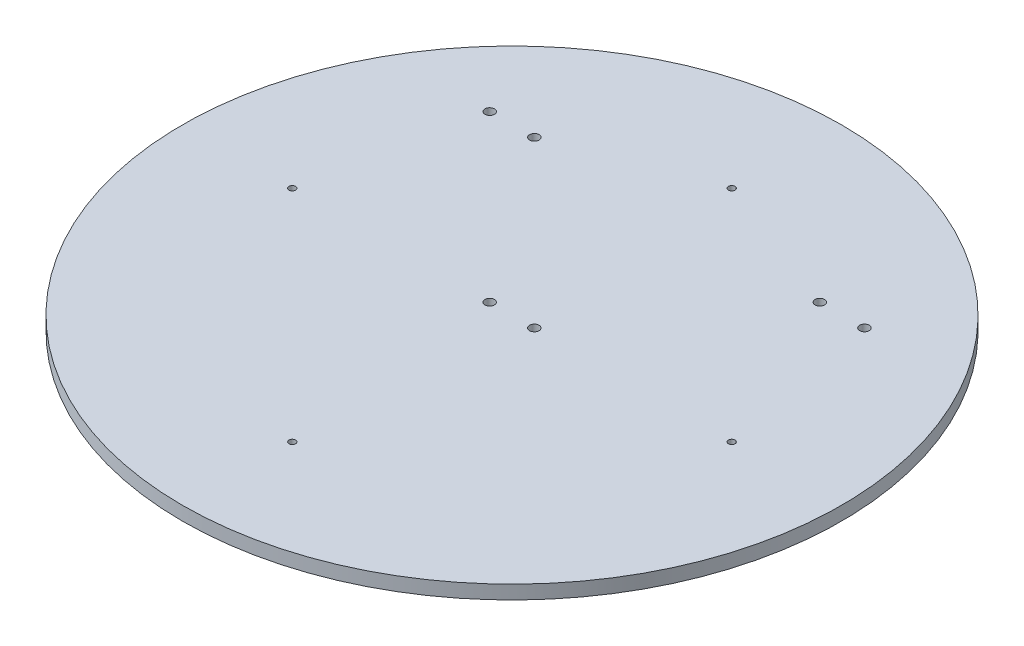
ISO-10303-21;
HEADER;
FILE_DESCRIPTION(('STEP AP214'),'2;1');
FILE_NAME('part.step','',(''),(''),'','','');
FILE_SCHEMA(('AUTOMOTIVE_DESIGN { 1 0 10303 214 1 1 1 1 }'));
ENDSEC;
DATA;
#1=APPLICATION_CONTEXT('core data for automotive mechanical design processes');
#2=APPLICATION_PROTOCOL_DEFINITION('international standard','automotive_design',2000,#1);
#3=PRODUCT_CONTEXT('',#1,'mechanical');
#4=PRODUCT('Part','Part','',(#3));
#5=PRODUCT_RELATED_PRODUCT_CATEGORY('part','',(#4));
#6=PRODUCT_DEFINITION_FORMATION('','',#4);
#7=PRODUCT_DEFINITION_CONTEXT('part definition',#1,'design');
#8=PRODUCT_DEFINITION('design','',#6,#7);
#9=PRODUCT_DEFINITION_SHAPE('','',#8);
#10=(LENGTH_UNIT() NAMED_UNIT(*) SI_UNIT(.MILLI.,.METRE.));
#11=(NAMED_UNIT(*) PLANE_ANGLE_UNIT() SI_UNIT($,.RADIAN.));
#12=(NAMED_UNIT(*) SI_UNIT($,.STERADIAN.) SOLID_ANGLE_UNIT());
#13=UNCERTAINTY_MEASURE_WITH_UNIT(LENGTH_MEASURE(1.E-05),#10,'distance_accuracy_value','');
#14=(GEOMETRIC_REPRESENTATION_CONTEXT(3) GLOBAL_UNCERTAINTY_ASSIGNED_CONTEXT((#13)) GLOBAL_UNIT_ASSIGNED_CONTEXT((#10,
#11,#12)) REPRESENTATION_CONTEXT('',''));
#15=CARTESIAN_POINT('',(0.,0.,0.));
#16=DIRECTION('',(0.,0.,1.));
#17=DIRECTION('',(1.,0.,0.));
#18=AXIS2_PLACEMENT_3D('',#15,#16,#17);
#19=CARTESIAN_POINT('',(0.,3.175,0.));
#20=DIRECTION('',(0.,-1.,0.));
#21=DIRECTION('',(0.,0.,-1.));
#22=AXIS2_PLACEMENT_3D('',#19,#20,#21);
#23=CYLINDRICAL_SURFACE('',#22,152.4);
#24=CARTESIAN_POINT('',(0.,3.175,0.));
#25=DIRECTION('',(0.,1.,0.));
#26=DIRECTION('',(0.,0.,1.));
#27=AXIS2_PLACEMENT_3D('',#24,#25,#26);
#28=CIRCLE('',#27,152.4);
#29=CARTESIAN_POINT('',(0.,3.175,152.4));
#30=VERTEX_POINT('',#29);
#31=EDGE_CURVE('E10',#30,#30,#28,.T.);
#32=ORIENTED_EDGE('',*,*,#31,.F.);
#33=EDGE_LOOP('',(#32));
#34=FACE_BOUND('',#33,.T.);
#35=CARTESIAN_POINT('',(0.,-3.175,0.));
#36=DIRECTION('',(0.,1.,0.));
#37=DIRECTION('',(0.,0.,1.));
#38=AXIS2_PLACEMENT_3D('',#35,#36,#37);
#39=CIRCLE('',#38,152.4);
#40=CARTESIAN_POINT('',(0.,-3.175,152.4));
#41=VERTEX_POINT('',#40);
#42=EDGE_CURVE('E36',#41,#41,#39,.T.);
#43=ORIENTED_EDGE('',*,*,#42,.T.);
#44=EDGE_LOOP('',(#43));
#45=FACE_BOUND('',#44,.T.);
#46=ADVANCED_FACE('F33',(#34,#45),#23,.T.);
#47=CARTESIAN_POINT('',(0.,3.175,0.));
#48=DIRECTION('',(0.,1.,0.));
#49=DIRECTION('',(0.,0.,1.));
#50=AXIS2_PLACEMENT_3D('',#47,#48,#49);
#51=PLANE('',#50);
#52=CARTESIAN_POINT('',(0.,3.175,-101.6));
#53=DIRECTION('',(0.,1.,0.));
#54=DIRECTION('',(0.,0.,1.));
#55=AXIS2_PLACEMENT_3D('',#52,#53,#54);
#56=CIRCLE('',#55,1.524);
#57=CARTESIAN_POINT('',(0.,3.175,-100.076));
#58=VERTEX_POINT('',#57);
#59=EDGE_CURVE('E99',#58,#58,#56,.T.);
#60=ORIENTED_EDGE('',*,*,#59,.F.);
#61=EDGE_LOOP('',(#60));
#62=FACE_BOUND('',#61,.T.);
#63=CARTESIAN_POINT('',(101.6,3.175,0.));
#64=DIRECTION('',(0.,1.,0.));
#65=DIRECTION('',(0.,0.,1.));
#66=AXIS2_PLACEMENT_3D('',#63,#64,#65);
#67=CIRCLE('',#66,1.52400000000001);
#68=CARTESIAN_POINT('',(101.6,3.175,1.52400000000001));
#69=VERTEX_POINT('',#68);
#70=EDGE_CURVE('E93',#69,#69,#67,.T.);
#71=ORIENTED_EDGE('',*,*,#70,.F.);
#72=EDGE_LOOP('',(#71));
#73=FACE_BOUND('',#72,.T.);
#74=CARTESIAN_POINT('',(0.,3.175,101.6));
#75=DIRECTION('',(0.,1.,0.));
#76=DIRECTION('',(0.,0.,1.));
#77=AXIS2_PLACEMENT_3D('',#74,#75,#76);
#78=CIRCLE('',#77,1.524);
#79=CARTESIAN_POINT('',(0.,3.175,103.124));
#80=VERTEX_POINT('',#79);
#81=EDGE_CURVE('E87',#80,#80,#78,.T.);
#82=ORIENTED_EDGE('',*,*,#81,.F.);
#83=EDGE_LOOP('',(#82));
#84=FACE_BOUND('',#83,.T.);
#85=CARTESIAN_POINT('',(-101.6,3.175,0.));
#86=DIRECTION('',(0.,1.,0.));
#87=DIRECTION('',(0.,0.,1.));
#88=AXIS2_PLACEMENT_3D('',#85,#86,#87);
#89=CIRCLE('',#88,1.52400000000001);
#90=CARTESIAN_POINT('',(-101.6,3.175,1.52400000000001));
#91=VERTEX_POINT('',#90);
#92=EDGE_CURVE('E81',#91,#91,#89,.T.);
#93=ORIENTED_EDGE('',*,*,#92,.F.);
#94=EDGE_LOOP('',(#93));
#95=FACE_BOUND('',#94,.T.);
#96=CARTESIAN_POINT('',(-66.013427029088,3.175,-76.3321770290876));
#97=DIRECTION('',(0.,1.,0.));
#98=DIRECTION('',(0.,0.,1.));
#99=AXIS2_PLACEMENT_3D('',#96,#97,#98);
#100=CIRCLE('',#99,2.20345);
#101=CARTESIAN_POINT('',(-66.013427029088,3.175,-74.1287270290876));
#102=VERTEX_POINT('',#101);
#103=EDGE_CURVE('E63',#102,#102,#100,.T.);
#104=ORIENTED_EDGE('',*,*,#103,.F.);
#105=EDGE_LOOP('',(#104));
#106=FACE_BOUND('',#105,.T.);
#107=CARTESIAN_POINT('',(-86.650927029088,3.175,-76.3321770290876));
#108=DIRECTION('',(0.,1.,0.));
#109=DIRECTION('',(0.,0.,1.));
#110=AXIS2_PLACEMENT_3D('',#107,#108,#109);
#111=CIRCLE('',#110,2.20345000000001);
#112=CARTESIAN_POINT('',(-86.650927029088,3.175,-74.1287270290876));
#113=VERTEX_POINT('',#112);
#114=EDGE_CURVE('E70',#113,#113,#111,.T.);
#115=ORIENTED_EDGE('',*,*,#114,.F.);
#116=EDGE_LOOP('',(#115));
#117=FACE_BOUND('',#116,.T.);
#118=CARTESIAN_POINT('',(86.6509270290877,3.175,-76.3321770290879));
#119=DIRECTION('',(0.,1.,0.));
#120=DIRECTION('',(0.,0.,1.));
#121=AXIS2_PLACEMENT_3D('',#118,#119,#120);
#122=CIRCLE('',#121,2.20345);
#123=CARTESIAN_POINT('',(86.6509270290877,3.175,-74.1287270290879));
#124=VERTEX_POINT('',#123);
#125=EDGE_CURVE('E76',#124,#124,#122,.T.);
#126=ORIENTED_EDGE('',*,*,#125,.F.);
#127=EDGE_LOOP('',(#126));
#128=FACE_BOUND('',#127,.T.);
#129=CARTESIAN_POINT('',(66.0134270290877,3.175,-76.3321770290879));
#130=DIRECTION('',(0.,1.,0.));
#131=DIRECTION('',(0.,0.,1.));
#132=AXIS2_PLACEMENT_3D('',#129,#130,#131);
#133=CIRCLE('',#132,2.20345000000001);
#134=CARTESIAN_POINT('',(66.0134270290877,3.175,-74.1287270290879));
#135=VERTEX_POINT('',#134);
#136=EDGE_CURVE('E51',#135,#135,#133,.T.);
#137=ORIENTED_EDGE('',*,*,#136,.F.);
#138=EDGE_LOOP('',(#137));
#139=FACE_BOUND('',#138,.T.);
#140=CARTESIAN_POINT('',(10.31875,3.175,0.));
#141=DIRECTION('',(0.,1.,0.));
#142=DIRECTION('',(0.,0.,1.));
#143=AXIS2_PLACEMENT_3D('',#140,#141,#142);
#144=CIRCLE('',#143,2.20344999999999);
#145=CARTESIAN_POINT('',(10.31875,3.175,2.20344999999999));
#146=VERTEX_POINT('',#145);
#147=EDGE_CURVE('E58',#146,#146,#144,.T.);
#148=ORIENTED_EDGE('',*,*,#147,.F.);
#149=EDGE_LOOP('',(#148));
#150=FACE_BOUND('',#149,.T.);
#151=CARTESIAN_POINT('',(-10.31875,3.175,0.));
#152=DIRECTION('',(0.,1.,0.));
#153=DIRECTION('',(0.,0.,1.));
#154=AXIS2_PLACEMENT_3D('',#151,#152,#153);
#155=CIRCLE('',#154,2.20345000000001);
#156=CARTESIAN_POINT('',(-10.31875,3.175,2.20345000000001));
#157=VERTEX_POINT('',#156);
#158=EDGE_CURVE('E45',#157,#157,#155,.T.);
#159=ORIENTED_EDGE('',*,*,#158,.F.);
#160=EDGE_LOOP('',(#159));
#161=FACE_BOUND('',#160,.T.);
#162=ORIENTED_EDGE('',*,*,#31,.T.);
#163=EDGE_LOOP('',(#162));
#164=FACE_BOUND('',#163,.T.);
#165=ADVANCED_FACE('F115',(#62,#73,#84,#95,#106,#117,#128,#139,#150,#161,#164),#51,.T.);
#166=CARTESIAN_POINT('',(0.,-3.175,0.));
#167=DIRECTION('',(0.,1.,0.));
#168=DIRECTION('',(0.,0.,1.));
#169=AXIS2_PLACEMENT_3D('',#166,#167,#168);
#170=PLANE('',#169);
#171=CARTESIAN_POINT('',(0.,-3.175,-101.6));
#172=DIRECTION('',(0.,1.,0.));
#173=DIRECTION('',(0.,0.,1.));
#174=AXIS2_PLACEMENT_3D('',#171,#172,#173);
#175=CIRCLE('',#174,1.524);
#176=CARTESIAN_POINT('',(0.,-3.175,-100.076));
#177=VERTEX_POINT('',#176);
#178=EDGE_CURVE('E84',#177,#177,#175,.T.);
#179=ORIENTED_EDGE('',*,*,#178,.T.);
#180=EDGE_LOOP('',(#179));
#181=FACE_BOUND('',#180,.T.);
#182=CARTESIAN_POINT('',(101.6,-3.175,0.));
#183=DIRECTION('',(0.,1.,0.));
#184=DIRECTION('',(0.,0.,1.));
#185=AXIS2_PLACEMENT_3D('',#182,#183,#184);
#186=CIRCLE('',#185,1.52400000000001);
#187=CARTESIAN_POINT('',(101.6,-3.175,1.52400000000001));
#188=VERTEX_POINT('',#187);
#189=EDGE_CURVE('E96',#188,#188,#186,.T.);
#190=ORIENTED_EDGE('',*,*,#189,.T.);
#191=EDGE_LOOP('',(#190));
#192=FACE_BOUND('',#191,.T.);
#193=CARTESIAN_POINT('',(0.,-3.175,101.6));
#194=DIRECTION('',(0.,1.,0.));
#195=DIRECTION('',(0.,0.,1.));
#196=AXIS2_PLACEMENT_3D('',#193,#194,#195);
#197=CIRCLE('',#196,1.524);
#198=CARTESIAN_POINT('',(0.,-3.175,103.124));
#199=VERTEX_POINT('',#198);
#200=EDGE_CURVE('E90',#199,#199,#197,.T.);
#201=ORIENTED_EDGE('',*,*,#200,.T.);
#202=EDGE_LOOP('',(#201));
#203=FACE_BOUND('',#202,.T.);
#204=CARTESIAN_POINT('',(-101.6,-3.175,0.));
#205=DIRECTION('',(0.,1.,0.));
#206=DIRECTION('',(0.,0.,1.));
#207=AXIS2_PLACEMENT_3D('',#204,#205,#206);
#208=CIRCLE('',#207,1.52400000000001);
#209=CARTESIAN_POINT('',(-101.6,-3.175,1.52400000000001));
#210=VERTEX_POINT('',#209);
#211=EDGE_CURVE('E67',#210,#210,#208,.T.);
#212=ORIENTED_EDGE('',*,*,#211,.T.);
#213=EDGE_LOOP('',(#212));
#214=FACE_BOUND('',#213,.T.);
#215=CARTESIAN_POINT('',(-66.013427029088,-3.175,-76.3321770290876));
#216=DIRECTION('',(0.,1.,0.));
#217=DIRECTION('',(0.,0.,1.));
#218=AXIS2_PLACEMENT_3D('',#215,#216,#217);
#219=CIRCLE('',#218,2.20345);
#220=CARTESIAN_POINT('',(-66.013427029088,-3.175,-74.1287270290876));
#221=VERTEX_POINT('',#220);
#222=EDGE_CURVE('E66',#221,#221,#219,.T.);
#223=ORIENTED_EDGE('',*,*,#222,.T.);
#224=EDGE_LOOP('',(#223));
#225=FACE_BOUND('',#224,.T.);
#226=CARTESIAN_POINT('',(-86.650927029088,-3.175,-76.3321770290876));
#227=DIRECTION('',(0.,1.,0.));
#228=DIRECTION('',(0.,0.,1.));
#229=AXIS2_PLACEMENT_3D('',#226,#227,#228);
#230=CIRCLE('',#229,2.20345000000001);
#231=CARTESIAN_POINT('',(-86.650927029088,-3.175,-74.1287270290876));
#232=VERTEX_POINT('',#231);
#233=EDGE_CURVE('E73',#232,#232,#230,.T.);
#234=ORIENTED_EDGE('',*,*,#233,.T.);
#235=EDGE_LOOP('',(#234));
#236=FACE_BOUND('',#235,.T.);
#237=CARTESIAN_POINT('',(86.6509270290877,-3.175,-76.3321770290879));
#238=DIRECTION('',(0.,1.,0.));
#239=DIRECTION('',(0.,0.,1.));
#240=AXIS2_PLACEMENT_3D('',#237,#238,#239);
#241=CIRCLE('',#240,2.20345);
#242=CARTESIAN_POINT('',(86.6509270290877,-3.175,-74.1287270290879));
#243=VERTEX_POINT('',#242);
#244=EDGE_CURVE('E55',#243,#243,#241,.T.);
#245=ORIENTED_EDGE('',*,*,#244,.T.);
#246=EDGE_LOOP('',(#245));
#247=FACE_BOUND('',#246,.T.);
#248=CARTESIAN_POINT('',(66.0134270290877,-3.175,-76.3321770290879));
#249=DIRECTION('',(0.,1.,0.));
#250=DIRECTION('',(0.,0.,1.));
#251=AXIS2_PLACEMENT_3D('',#248,#249,#250);
#252=CIRCLE('',#251,2.20345000000001);
#253=CARTESIAN_POINT('',(66.0134270290877,-3.175,-74.1287270290879));
#254=VERTEX_POINT('',#253);
#255=EDGE_CURVE('E54',#254,#254,#252,.T.);
#256=ORIENTED_EDGE('',*,*,#255,.T.);
#257=EDGE_LOOP('',(#256));
#258=FACE_BOUND('',#257,.T.);
#259=CARTESIAN_POINT('',(10.31875,-3.175,0.));
#260=DIRECTION('',(0.,1.,0.));
#261=DIRECTION('',(0.,0.,1.));
#262=AXIS2_PLACEMENT_3D('',#259,#260,#261);
#263=CIRCLE('',#262,2.20344999999999);
#264=CARTESIAN_POINT('',(10.31875,-3.175,2.20344999999999));
#265=VERTEX_POINT('',#264);
#266=EDGE_CURVE('E48',#265,#265,#263,.T.);
#267=ORIENTED_EDGE('',*,*,#266,.T.);
#268=EDGE_LOOP('',(#267));
#269=FACE_BOUND('',#268,.T.);
#270=CARTESIAN_POINT('',(-10.31875,-3.175,0.));
#271=DIRECTION('',(0.,1.,0.));
#272=DIRECTION('',(0.,0.,1.));
#273=AXIS2_PLACEMENT_3D('',#270,#271,#272);
#274=CIRCLE('',#273,2.20345000000001);
#275=CARTESIAN_POINT('',(-10.31875,-3.175,2.20345000000001));
#276=VERTEX_POINT('',#275);
#277=EDGE_CURVE('E43',#276,#276,#274,.T.);
#278=ORIENTED_EDGE('',*,*,#277,.T.);
#279=EDGE_LOOP('',(#278));
#280=FACE_BOUND('',#279,.T.);
#281=ORIENTED_EDGE('',*,*,#42,.F.);
#282=EDGE_LOOP('',(#281));
#283=FACE_BOUND('',#282,.T.);
#284=ADVANCED_FACE('F105',(#181,#192,#203,#214,#225,#236,#247,#258,#269,#280,#283),#170,.F.);
#285=CARTESIAN_POINT('',(-10.31875,-3.175,0.));
#286=DIRECTION('',(0.,1.,0.));
#287=DIRECTION('',(0.,0.,1.));
#288=AXIS2_PLACEMENT_3D('',#285,#286,#287);
#289=CYLINDRICAL_SURFACE('',#288,2.20345000000001);
#290=ORIENTED_EDGE('',*,*,#277,.F.);
#291=EDGE_LOOP('',(#290));
#292=FACE_BOUND('',#291,.T.);
#293=ORIENTED_EDGE('',*,*,#158,.T.);
#294=EDGE_LOOP('',(#293));
#295=FACE_BOUND('',#294,.T.);
#296=ADVANCED_FACE('F137',(#292,#295),#289,.F.);
#297=CARTESIAN_POINT('',(10.31875,-3.175,0.));
#298=DIRECTION('',(0.,1.,0.));
#299=DIRECTION('',(0.,0.,1.));
#300=AXIS2_PLACEMENT_3D('',#297,#298,#299);
#301=CYLINDRICAL_SURFACE('',#300,2.20344999999999);
#302=ORIENTED_EDGE('',*,*,#266,.F.);
#303=EDGE_LOOP('',(#302));
#304=FACE_BOUND('',#303,.T.);
#305=ORIENTED_EDGE('',*,*,#147,.T.);
#306=EDGE_LOOP('',(#305));
#307=FACE_BOUND('',#306,.T.);
#308=ADVANCED_FACE('F139',(#304,#307),#301,.F.);
#309=CARTESIAN_POINT('',(66.0134270290877,-3.175,-76.3321770290879));
#310=DIRECTION('',(0.,1.,0.));
#311=DIRECTION('',(0.,0.,1.));
#312=AXIS2_PLACEMENT_3D('',#309,#310,#311);
#313=CYLINDRICAL_SURFACE('',#312,2.20345000000001);
#314=ORIENTED_EDGE('',*,*,#255,.F.);
#315=EDGE_LOOP('',(#314));
#316=FACE_BOUND('',#315,.T.);
#317=ORIENTED_EDGE('',*,*,#136,.T.);
#318=EDGE_LOOP('',(#317));
#319=FACE_BOUND('',#318,.T.);
#320=ADVANCED_FACE('F146',(#316,#319),#313,.F.);
#321=CARTESIAN_POINT('',(86.6509270290877,-3.175,-76.3321770290879));
#322=DIRECTION('',(0.,1.,0.));
#323=DIRECTION('',(0.,0.,1.));
#324=AXIS2_PLACEMENT_3D('',#321,#322,#323);
#325=CYLINDRICAL_SURFACE('',#324,2.20345);
#326=ORIENTED_EDGE('',*,*,#244,.F.);
#327=EDGE_LOOP('',(#326));
#328=FACE_BOUND('',#327,.T.);
#329=ORIENTED_EDGE('',*,*,#125,.T.);
#330=EDGE_LOOP('',(#329));
#331=FACE_BOUND('',#330,.T.);
#332=ADVANCED_FACE('F213',(#328,#331),#325,.F.);
#333=CARTESIAN_POINT('',(-86.650927029088,-3.175,-76.3321770290876));
#334=DIRECTION('',(0.,1.,0.));
#335=DIRECTION('',(0.,0.,1.));
#336=AXIS2_PLACEMENT_3D('',#333,#334,#335);
#337=CYLINDRICAL_SURFACE('',#336,2.20345000000001);
#338=ORIENTED_EDGE('',*,*,#233,.F.);
#339=EDGE_LOOP('',(#338));
#340=FACE_BOUND('',#339,.T.);
#341=ORIENTED_EDGE('',*,*,#114,.T.);
#342=EDGE_LOOP('',(#341));
#343=FACE_BOUND('',#342,.T.);
#344=ADVANCED_FACE('F216',(#340,#343),#337,.F.);
#345=CARTESIAN_POINT('',(-66.013427029088,-3.175,-76.3321770290876));
#346=DIRECTION('',(0.,1.,0.));
#347=DIRECTION('',(0.,0.,1.));
#348=AXIS2_PLACEMENT_3D('',#345,#346,#347);
#349=CYLINDRICAL_SURFACE('',#348,2.20345);
#350=ORIENTED_EDGE('',*,*,#222,.F.);
#351=EDGE_LOOP('',(#350));
#352=FACE_BOUND('',#351,.T.);
#353=ORIENTED_EDGE('',*,*,#103,.T.);
#354=EDGE_LOOP('',(#353));
#355=FACE_BOUND('',#354,.T.);
#356=ADVANCED_FACE('F179',(#352,#355),#349,.F.);
#357=CARTESIAN_POINT('',(-101.6,-3.175,0.));
#358=DIRECTION('',(0.,1.,0.));
#359=DIRECTION('',(0.,0.,1.));
#360=AXIS2_PLACEMENT_3D('',#357,#358,#359);
#361=CYLINDRICAL_SURFACE('',#360,1.52400000000001);
#362=ORIENTED_EDGE('',*,*,#211,.F.);
#363=EDGE_LOOP('',(#362));
#364=FACE_BOUND('',#363,.T.);
#365=ORIENTED_EDGE('',*,*,#92,.T.);
#366=EDGE_LOOP('',(#365));
#367=FACE_BOUND('',#366,.T.);
#368=ADVANCED_FACE('F173',(#364,#367),#361,.F.);
#369=CARTESIAN_POINT('',(0.,-3.175,101.6));
#370=DIRECTION('',(0.,1.,0.));
#371=DIRECTION('',(0.,0.,1.));
#372=AXIS2_PLACEMENT_3D('',#369,#370,#371);
#373=CYLINDRICAL_SURFACE('',#372,1.524);
#374=ORIENTED_EDGE('',*,*,#200,.F.);
#375=EDGE_LOOP('',(#374));
#376=FACE_BOUND('',#375,.T.);
#377=ORIENTED_EDGE('',*,*,#81,.T.);
#378=EDGE_LOOP('',(#377));
#379=FACE_BOUND('',#378,.T.);
#380=ADVANCED_FACE('F178',(#376,#379),#373,.F.);
#381=CARTESIAN_POINT('',(101.6,-3.175,0.));
#382=DIRECTION('',(0.,1.,0.));
#383=DIRECTION('',(0.,0.,1.));
#384=AXIS2_PLACEMENT_3D('',#381,#382,#383);
#385=CYLINDRICAL_SURFACE('',#384,1.52400000000001);
#386=ORIENTED_EDGE('',*,*,#189,.F.);
#387=EDGE_LOOP('',(#386));
#388=FACE_BOUND('',#387,.T.);
#389=ORIENTED_EDGE('',*,*,#70,.T.);
#390=EDGE_LOOP('',(#389));
#391=FACE_BOUND('',#390,.T.);
#392=ADVANCED_FACE('F111',(#388,#391),#385,.F.);
#393=CARTESIAN_POINT('',(0.,-3.175,-101.6));
#394=DIRECTION('',(0.,1.,0.));
#395=DIRECTION('',(0.,0.,1.));
#396=AXIS2_PLACEMENT_3D('',#393,#394,#395);
#397=CYLINDRICAL_SURFACE('',#396,1.524);
#398=ORIENTED_EDGE('',*,*,#178,.F.);
#399=EDGE_LOOP('',(#398));
#400=FACE_BOUND('',#399,.T.);
#401=ORIENTED_EDGE('',*,*,#59,.T.);
#402=EDGE_LOOP('',(#401));
#403=FACE_BOUND('',#402,.T.);
#404=ADVANCED_FACE('F108',(#400,#403),#397,.F.);
#405=CLOSED_SHELL('',(#46,#165,#284,#296,#308,#320,#332,#344,#356,#368,#380,#392,#404));
#406=MANIFOLD_SOLID_BREP('B2',#405);
#407=ADVANCED_BREP_SHAPE_REPRESENTATION('',(#18,#406),#14);
#408=SHAPE_DEFINITION_REPRESENTATION(#9,#407);
ENDSEC;
END-ISO-10303-21;
